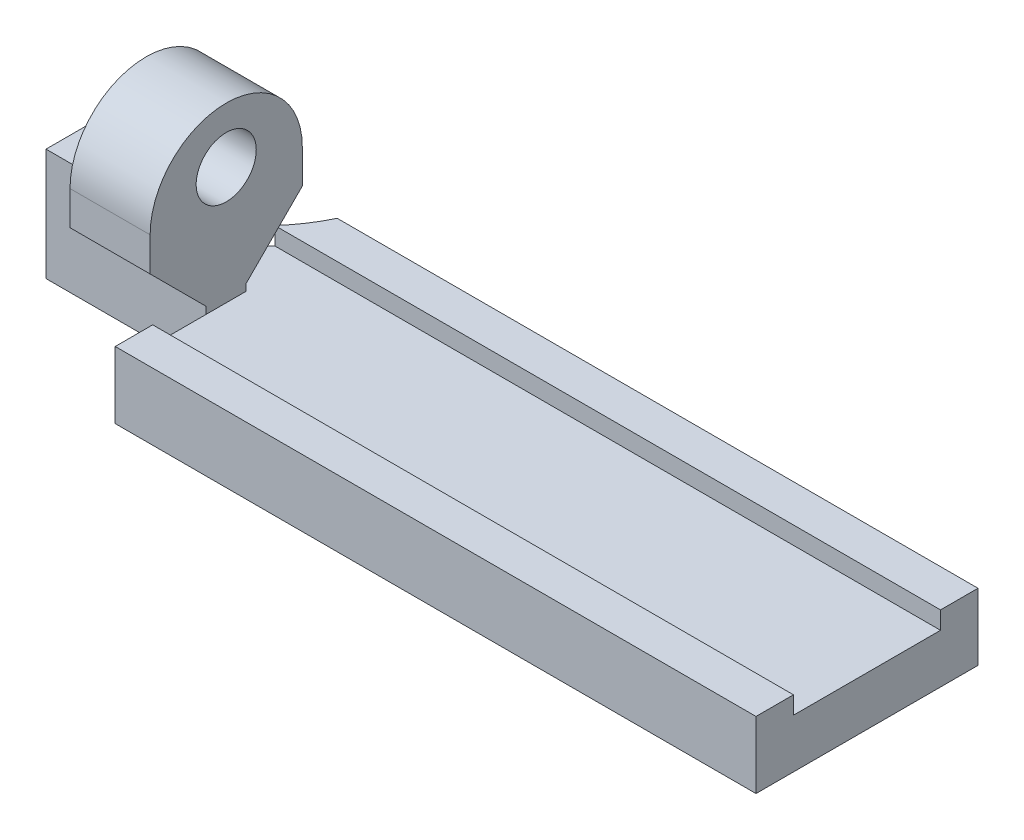
ISO-10303-21;
HEADER;
FILE_DESCRIPTION(('STEP AP214'),'2;1');
FILE_NAME('part.step','',(''),(''),'','','');
FILE_SCHEMA(('AUTOMOTIVE_DESIGN { 1 0 10303 214 1 1 1 1 }'));
ENDSEC;
DATA;
#1=APPLICATION_CONTEXT('core data for automotive mechanical design processes');
#2=APPLICATION_PROTOCOL_DEFINITION('international standard','automotive_design',2000,#1);
#3=PRODUCT_CONTEXT('',#1,'mechanical');
#4=PRODUCT('Part','Part','',(#3));
#5=PRODUCT_RELATED_PRODUCT_CATEGORY('part','',(#4));
#6=PRODUCT_DEFINITION_FORMATION('','',#4);
#7=PRODUCT_DEFINITION_CONTEXT('part definition',#1,'design');
#8=PRODUCT_DEFINITION('design','',#6,#7);
#9=PRODUCT_DEFINITION_SHAPE('','',#8);
#10=(LENGTH_UNIT() NAMED_UNIT(*) SI_UNIT(.MILLI.,.METRE.));
#11=(NAMED_UNIT(*) PLANE_ANGLE_UNIT() SI_UNIT($,.RADIAN.));
#12=(NAMED_UNIT(*) SI_UNIT($,.STERADIAN.) SOLID_ANGLE_UNIT());
#13=UNCERTAINTY_MEASURE_WITH_UNIT(LENGTH_MEASURE(1.E-05),#10,'distance_accuracy_value','');
#14=(GEOMETRIC_REPRESENTATION_CONTEXT(3) GLOBAL_UNCERTAINTY_ASSIGNED_CONTEXT((#13)) GLOBAL_UNIT_ASSIGNED_CONTEXT((#10,
#11,#12)) REPRESENTATION_CONTEXT('',''));
#15=CARTESIAN_POINT('',(0.,0.,0.));
#16=DIRECTION('',(0.,0.,1.));
#17=DIRECTION('',(1.,0.,0.));
#18=AXIS2_PLACEMENT_3D('',#15,#16,#17);
#19=CARTESIAN_POINT('',(0.,8.89,3.175));
#20=DIRECTION('',(-1.,0.,0.));
#21=DIRECTION('',(0.,0.,1.));
#22=AXIS2_PLACEMENT_3D('',#19,#20,#21);
#23=PLANE('',#22);
#24=CARTESIAN_POINT('',(0.,13.208,1.58750000000003));
#25=DIRECTION('',(1.,0.,0.));
#26=DIRECTION('',(0.,0.,-1.));
#27=AXIS2_PLACEMENT_3D('',#24,#25,#26);
#28=CIRCLE('',#27,2.38125);
#29=CARTESIAN_POINT('',(0.,13.208,-0.793749999999969));
#30=VERTEX_POINT('',#29);
#31=EDGE_CURVE('E202',#30,#30,#28,.T.);
#32=ORIENTED_EDGE('',*,*,#31,.F.);
#33=EDGE_LOOP('',(#32));
#34=FACE_BOUND('',#33,.T.);
#35=DIRECTION('',(0.,0.,1.));
#36=VECTOR('',#35,1.);
#37=CARTESIAN_POINT('',(0.,3.89555823391104,3.175));
#38=LINE('',#37,#36);
#39=CARTESIAN_POINT('',(0.,3.89555823391104,0.));
#40=VERTEX_POINT('',#39);
#41=CARTESIAN_POINT('',(0.,3.89555823391104,3.175));
#42=VERTEX_POINT('',#41);
#43=EDGE_CURVE('E285',#40,#42,#38,.T.);
#44=ORIENTED_EDGE('',*,*,#43,.F.);
#45=DIRECTION('',(0.,1.,0.));
#46=VECTOR('',#45,1.);
#47=CARTESIAN_POINT('',(0.,8.89,0.));
#48=LINE('',#47,#46);
#49=CARTESIAN_POINT('',(0.,4.445,0.));
#50=VERTEX_POINT('',#49);
#51=EDGE_CURVE('E251',#40,#50,#48,.T.);
#52=ORIENTED_EDGE('',*,*,#51,.T.);
#53=DIRECTION('',(0.,0.707106781186549,-0.707106781186546));
#54=VECTOR('',#53,1.);
#55=CARTESIAN_POINT('',(0.,4.445,0.));
#56=LINE('',#55,#54);
#57=CARTESIAN_POINT('',(0.,8.89,-4.44499999999998));
#58=VERTEX_POINT('',#57);
#59=EDGE_CURVE('E206',#50,#58,#56,.T.);
#60=ORIENTED_EDGE('',*,*,#59,.T.);
#61=DIRECTION('',(0.,1.,0.));
#62=VECTOR('',#61,1.);
#63=CARTESIAN_POINT('',(0.,8.89,-4.44499999999998));
#64=LINE('',#63,#62);
#65=CARTESIAN_POINT('',(0.,11.578578051239,-4.44499999999998));
#66=VERTEX_POINT('',#65);
#67=EDGE_CURVE('E237',#58,#66,#64,.T.);
#68=ORIENTED_EDGE('',*,*,#67,.T.);
#69=CARTESIAN_POINT('',(0.,11.578578051239,1.58750000000003));
#70=DIRECTION('',(1.,0.,0.));
#71=DIRECTION('',(0.,0.,1.));
#72=AXIS2_PLACEMENT_3D('',#69,#70,#71);
#73=CIRCLE('',#72,6.03250000000002);
#74=CARTESIAN_POINT('',(0.,11.578578051239,7.62000000000005));
#75=VERTEX_POINT('',#74);
#76=EDGE_CURVE('E240',#66,#75,#73,.T.);
#77=ORIENTED_EDGE('',*,*,#76,.T.);
#78=DIRECTION('',(0.,-1.,0.));
#79=VECTOR('',#78,1.);
#80=CARTESIAN_POINT('',(0.,8.88999999999995,7.62000000000005));
#81=LINE('',#80,#79);
#82=CARTESIAN_POINT('',(0.,8.88999999999995,7.62000000000005));
#83=VERTEX_POINT('',#82);
#84=EDGE_CURVE('E243',#75,#83,#81,.T.);
#85=ORIENTED_EDGE('',*,*,#84,.T.);
#86=DIRECTION('',(0.,-0.70710678118654,-0.707106781186555));
#87=VECTOR('',#86,1.);
#88=CARTESIAN_POINT('',(0.,4.445,3.175));
#89=LINE('',#88,#87);
#90=CARTESIAN_POINT('',(0.,4.445,3.175));
#91=VERTEX_POINT('',#90);
#92=EDGE_CURVE('E213',#83,#91,#89,.T.);
#93=ORIENTED_EDGE('',*,*,#92,.T.);
#94=DIRECTION('',(0.,1.,0.));
#95=VECTOR('',#94,1.);
#96=CARTESIAN_POINT('',(0.,8.89,3.175));
#97=LINE('',#96,#95);
#98=EDGE_CURVE('E265',#42,#91,#97,.T.);
#99=ORIENTED_EDGE('',*,*,#98,.F.);
#100=EDGE_LOOP('',(#44,#52,#60,#68,#77,#85,#93,#99));
#101=FACE_BOUND('',#100,.T.);
#102=ADVANCED_FACE('F33',(#34,#101),#23,.F.);
#103=CARTESIAN_POINT('',(-12.7,8.89,3.175));
#104=DIRECTION('',(0.,-1.,0.));
#105=DIRECTION('',(0.,0.,-1.));
#106=AXIS2_PLACEMENT_3D('',#103,#104,#105);
#107=PLANE('',#106);
#108=CARTESIAN_POINT('',(-7.62,8.89,1.5875));
#109=DIRECTION('',(0.,1.,0.));
#110=DIRECTION('',(0.,0.,1.));
#111=AXIS2_PLACEMENT_3D('',#108,#109,#110);
#112=CIRCLE('',#111,1.190625);
#113=CARTESIAN_POINT('',(-7.62,8.89,2.778125));
#114=VERTEX_POINT('',#113);
#115=EDGE_CURVE('E191',#114,#114,#112,.T.);
#116=ORIENTED_EDGE('',*,*,#115,.F.);
#117=EDGE_LOOP('',(#116));
#118=FACE_BOUND('',#117,.T.);
#119=DIRECTION('',(-1.,0.,0.));
#120=VECTOR('',#119,1.);
#121=CARTESIAN_POINT('',(-12.7,8.89,3.175));
#122=LINE('',#121,#120);
#123=CARTESIAN_POINT('',(-6.35,8.89,3.175));
#124=VERTEX_POINT('',#123);
#125=CARTESIAN_POINT('',(-12.7,8.89,3.175));
#126=VERTEX_POINT('',#125);
#127=EDGE_CURVE('E264',#124,#126,#122,.T.);
#128=ORIENTED_EDGE('',*,*,#127,.F.);
#129=DIRECTION('',(0.,0.,-1.));
#130=VECTOR('',#129,1.);
#131=CARTESIAN_POINT('',(-6.35,8.89,3.175));
#132=LINE('',#131,#130);
#133=CARTESIAN_POINT('',(-6.35,8.89,0.));
#134=VERTEX_POINT('',#133);
#135=EDGE_CURVE('E212',#124,#134,#132,.T.);
#136=ORIENTED_EDGE('',*,*,#135,.T.);
#137=DIRECTION('',(-1.,0.,0.));
#138=VECTOR('',#137,1.);
#139=CARTESIAN_POINT('',(-12.7,8.89,0.));
#140=LINE('',#139,#138);
#141=CARTESIAN_POINT('',(-12.7,8.89,0.));
#142=VERTEX_POINT('',#141);
#143=EDGE_CURVE('E273',#134,#142,#140,.T.);
#144=ORIENTED_EDGE('',*,*,#143,.T.);
#145=DIRECTION('',(0.,0.,-1.));
#146=VECTOR('',#145,1.);
#147=CARTESIAN_POINT('',(-12.7,8.89,3.175));
#148=LINE('',#147,#146);
#149=EDGE_CURVE('E282',#126,#142,#148,.T.);
#150=ORIENTED_EDGE('',*,*,#149,.F.);
#151=EDGE_LOOP('',(#128,#136,#144,#150));
#152=FACE_BOUND('',#151,.T.);
#153=ADVANCED_FACE('F370',(#118,#152),#107,.F.);
#154=CARTESIAN_POINT('',(-12.7,0.,3.175));
#155=DIRECTION('',(1.,0.,0.));
#156=DIRECTION('',(0.,0.,-1.));
#157=AXIS2_PLACEMENT_3D('',#154,#155,#156);
#158=PLANE('',#157);
#159=DIRECTION('',(0.,-1.,0.));
#160=VECTOR('',#159,1.);
#161=CARTESIAN_POINT('',(-12.7,0.,0.));
#162=LINE('',#161,#160);
#163=CARTESIAN_POINT('',(-12.7,0.,0.));
#164=VERTEX_POINT('',#163);
#165=EDGE_CURVE('E275',#142,#164,#162,.T.);
#166=ORIENTED_EDGE('',*,*,#165,.T.);
#167=DIRECTION('',(0.,0.,-1.));
#168=VECTOR('',#167,1.);
#169=CARTESIAN_POINT('',(-12.7,0.,3.175));
#170=LINE('',#169,#168);
#171=CARTESIAN_POINT('',(-12.7,0.,3.175));
#172=VERTEX_POINT('',#171);
#173=EDGE_CURVE('E271',#172,#164,#170,.T.);
#174=ORIENTED_EDGE('',*,*,#173,.F.);
#175=DIRECTION('',(0.,-1.,0.));
#176=VECTOR('',#175,1.);
#177=CARTESIAN_POINT('',(-12.7,0.,3.175));
#178=LINE('',#177,#176);
#179=EDGE_CURVE('E267',#126,#172,#178,.T.);
#180=ORIENTED_EDGE('',*,*,#179,.F.);
#181=ORIENTED_EDGE('',*,*,#149,.T.);
#182=EDGE_LOOP('',(#166,#174,#180,#181));
#183=FACE_BOUND('',#182,.T.);
#184=ADVANCED_FACE('F376',(#183),#158,.F.);
#185=CARTESIAN_POINT('',(0.,0.,3.175));
#186=DIRECTION('',(0.,1.,0.));
#187=DIRECTION('',(0.,0.,1.));
#188=AXIS2_PLACEMENT_3D('',#185,#186,#187);
#189=PLANE('',#188);
#190=CARTESIAN_POINT('',(-7.62,0.,1.5875));
#191=DIRECTION('',(0.,1.,0.));
#192=DIRECTION('',(0.,0.,1.));
#193=AXIS2_PLACEMENT_3D('',#190,#191,#192);
#194=CIRCLE('',#193,1.190625);
#195=CARTESIAN_POINT('',(-7.62,0.,2.778125));
#196=VERTEX_POINT('',#195);
#197=EDGE_CURVE('E194',#196,#196,#194,.F.);
#198=ORIENTED_EDGE('',*,*,#197,.F.);
#199=EDGE_LOOP('',(#198));
#200=FACE_BOUND('',#199,.T.);
#201=DIRECTION('',(1.,0.,0.));
#202=VECTOR('',#201,1.);
#203=CARTESIAN_POINT('',(0.,0.,0.));
#204=LINE('',#203,#202);
#205=CARTESIAN_POINT('',(-11.4532860381116,0.,0.));
#206=VERTEX_POINT('',#205);
#207=EDGE_CURVE('E277',#164,#206,#204,.T.);
#208=ORIENTED_EDGE('',*,*,#207,.T.);
#209=CARTESIAN_POINT('',(-11.4532860381116,0.,-12.7));
#210=DIRECTION('',(0.,1.,0.));
#211=DIRECTION('',(0.,0.,1.));
#212=AXIS2_PLACEMENT_3D('',#209,#210,#211);
#213=CIRCLE('',#212,12.7);
#214=CARTESIAN_POINT('',(0.,0.,-7.21253802480625));
#215=VERTEX_POINT('',#214);
#216=EDGE_CURVE('E11',#206,#215,#213,.T.);
#217=ORIENTED_EDGE('',*,*,#216,.T.);
#218=DIRECTION('',(-1.,0.,0.));
#219=VECTOR('',#218,1.);
#220=CARTESIAN_POINT('',(50.8,0.,-7.21253802480625));
#221=LINE('',#220,#219);
#222=CARTESIAN_POINT('',(50.8,0.,-7.21253802480625));
#223=VERTEX_POINT('',#222);
#224=EDGE_CURVE('E311',#223,#215,#221,.T.);
#225=ORIENTED_EDGE('',*,*,#224,.F.);
#226=DIRECTION('',(0.,0.,-1.));
#227=VECTOR('',#226,1.);
#228=CARTESIAN_POINT('',(50.8,0.,10.3875380248062));
#229=LINE('',#228,#227);
#230=CARTESIAN_POINT('',(50.8,0.,10.3875380248062));
#231=VERTEX_POINT('',#230);
#232=EDGE_CURVE('E345',#231,#223,#229,.T.);
#233=ORIENTED_EDGE('',*,*,#232,.F.);
#234=DIRECTION('',(-1.,0.,0.));
#235=VECTOR('',#234,1.);
#236=CARTESIAN_POINT('',(50.8,0.,10.3875380248062));
#237=LINE('',#236,#235);
#238=CARTESIAN_POINT('',(0.,0.,10.3875380248062));
#239=VERTEX_POINT('',#238);
#240=EDGE_CURVE('E196',#231,#239,#237,.T.);
#241=ORIENTED_EDGE('',*,*,#240,.T.);
#242=DIRECTION('',(0.,0.,-1.));
#243=VECTOR('',#242,1.);
#244=CARTESIAN_POINT('',(0.,0.,-7.21253802480625));
#245=LINE('',#244,#243);
#246=CARTESIAN_POINT('',(0.,0.,3.175));
#247=VERTEX_POINT('',#246);
#248=EDGE_CURVE('E330',#239,#247,#245,.T.);
#249=ORIENTED_EDGE('',*,*,#248,.T.);
#250=DIRECTION('',(1.,0.,0.));
#251=VECTOR('',#250,1.);
#252=CARTESIAN_POINT('',(0.,0.,3.175));
#253=LINE('',#252,#251);
#254=EDGE_CURVE('E269',#172,#247,#253,.T.);
#255=ORIENTED_EDGE('',*,*,#254,.F.);
#256=ORIENTED_EDGE('',*,*,#173,.T.);
#257=EDGE_LOOP('',(#208,#217,#225,#233,#241,#249,#255,#256));
#258=FACE_BOUND('',#257,.T.);
#259=ADVANCED_FACE('F309',(#200,#258),#189,.F.);
#260=CARTESIAN_POINT('',(0.,0.,3.175));
#261=DIRECTION('',(0.,0.,-1.));
#262=DIRECTION('',(-1.,0.,0.));
#263=AXIS2_PLACEMENT_3D('',#260,#261,#262);
#264=PLANE('',#263);
#265=EDGE_CURVE('E262',#247,#42,#97,.T.);
#266=ORIENTED_EDGE('',*,*,#265,.T.);
#267=ORIENTED_EDGE('',*,*,#98,.T.);
#268=DIRECTION('',(1.,0.,0.));
#269=VECTOR('',#268,1.);
#270=CARTESIAN_POINT('',(-6.35,4.445,3.175));
#271=LINE('',#270,#269);
#272=CARTESIAN_POINT('',(-6.35,4.445,3.175));
#273=VERTEX_POINT('',#272);
#274=EDGE_CURVE('E248',#273,#91,#271,.T.);
#275=ORIENTED_EDGE('',*,*,#274,.F.);
#276=DIRECTION('',(0.,1.,0.));
#277=VECTOR('',#276,1.);
#278=CARTESIAN_POINT('',(-6.35,4.445,3.175));
#279=LINE('',#278,#277);
#280=EDGE_CURVE('E209',#273,#124,#279,.T.);
#281=ORIENTED_EDGE('',*,*,#280,.T.);
#282=ORIENTED_EDGE('',*,*,#127,.T.);
#283=ORIENTED_EDGE('',*,*,#179,.T.);
#284=ORIENTED_EDGE('',*,*,#254,.T.);
#285=EDGE_LOOP('',(#266,#267,#275,#281,#282,#283,#284));
#286=FACE_BOUND('',#285,.T.);
#287=ADVANCED_FACE('F358',(#286),#264,.F.);
#288=CARTESIAN_POINT('',(0.,0.,0.));
#289=DIRECTION('',(0.,0.,-1.));
#290=DIRECTION('',(-1.,0.,0.));
#291=AXIS2_PLACEMENT_3D('',#288,#289,#290);
#292=PLANE('',#291);
#293=ORIENTED_EDGE('',*,*,#51,.F.);
#294=DIRECTION('',(-1.,0.,0.));
#295=VECTOR('',#294,1.);
#296=CARTESIAN_POINT('',(0.,3.89555823391104,0.));
#297=LINE('',#296,#295);
#298=CARTESIAN_POINT('',(-11.4532860381116,3.89555823391104,0.));
#299=VERTEX_POINT('',#298);
#300=EDGE_CURVE('E48',#40,#299,#297,.T.);
#301=ORIENTED_EDGE('',*,*,#300,.T.);
#302=DIRECTION('',(0.,1.,0.));
#303=VECTOR('',#302,1.);
#304=CARTESIAN_POINT('',(-11.4532860381116,0.,0.));
#305=LINE('',#304,#303);
#306=EDGE_CURVE('E286',#299,#206,#305,.F.);
#307=ORIENTED_EDGE('',*,*,#306,.T.);
#308=ORIENTED_EDGE('',*,*,#207,.F.);
#309=ORIENTED_EDGE('',*,*,#165,.F.);
#310=ORIENTED_EDGE('',*,*,#143,.F.);
#311=DIRECTION('',(0.,-1.,0.));
#312=VECTOR('',#311,1.);
#313=CARTESIAN_POINT('',(-6.35,4.445,0.));
#314=LINE('',#313,#312);
#315=CARTESIAN_POINT('',(-6.35,4.445,0.));
#316=VERTEX_POINT('',#315);
#317=EDGE_CURVE('E216',#134,#316,#314,.T.);
#318=ORIENTED_EDGE('',*,*,#317,.T.);
#319=DIRECTION('',(1.,0.,0.));
#320=VECTOR('',#319,1.);
#321=CARTESIAN_POINT('',(-6.35,4.445,0.));
#322=LINE('',#321,#320);
#323=EDGE_CURVE('E234',#316,#50,#322,.T.);
#324=ORIENTED_EDGE('',*,*,#323,.T.);
#325=EDGE_LOOP('',(#293,#301,#307,#308,#309,#310,#318,#324));
#326=FACE_BOUND('',#325,.T.);
#327=ADVANCED_FACE('F299',(#326),#292,.T.);
#328=CARTESIAN_POINT('',(-6.35,4.445,3.175));
#329=DIRECTION('',(0.,-0.707106781186555,0.70710678118654));
#330=DIRECTION('',(0.,-0.70710678118654,-0.707106781186555));
#331=AXIS2_PLACEMENT_3D('',#328,#329,#330);
#332=PLANE('',#331);
#333=ORIENTED_EDGE('',*,*,#92,.F.);
#334=DIRECTION('',(1.,0.,0.));
#335=VECTOR('',#334,1.);
#336=CARTESIAN_POINT('',(-6.35,8.88999999999995,7.62000000000005));
#337=LINE('',#336,#335);
#338=CARTESIAN_POINT('',(-6.35,8.88999999999995,7.62000000000005));
#339=VERTEX_POINT('',#338);
#340=EDGE_CURVE('E252',#339,#83,#337,.T.);
#341=ORIENTED_EDGE('',*,*,#340,.F.);
#342=DIRECTION('',(0.,-0.70710678118654,-0.707106781186555));
#343=VECTOR('',#342,1.);
#344=CARTESIAN_POINT('',(-6.35,4.445,3.175));
#345=LINE('',#344,#343);
#346=EDGE_CURVE('E231',#339,#273,#345,.T.);
#347=ORIENTED_EDGE('',*,*,#346,.T.);
#348=ORIENTED_EDGE('',*,*,#274,.T.);
#349=EDGE_LOOP('',(#333,#341,#347,#348));
#350=FACE_BOUND('',#349,.T.);
#351=ADVANCED_FACE('F364',(#350),#332,.T.);
#352=CARTESIAN_POINT('',(-6.35,8.88999999999995,7.62000000000005));
#353=DIRECTION('',(0.,0.,1.));
#354=DIRECTION('',(0.,-1.,0.));
#355=AXIS2_PLACEMENT_3D('',#352,#353,#354);
#356=PLANE('',#355);
#357=ORIENTED_EDGE('',*,*,#84,.F.);
#358=DIRECTION('',(1.,0.,0.));
#359=VECTOR('',#358,1.);
#360=CARTESIAN_POINT('',(-6.35,11.578578051239,7.62000000000005));
#361=LINE('',#360,#359);
#362=CARTESIAN_POINT('',(-6.35,11.578578051239,7.62000000000005));
#363=VERTEX_POINT('',#362);
#364=EDGE_CURVE('E254',#363,#75,#361,.T.);
#365=ORIENTED_EDGE('',*,*,#364,.F.);
#366=DIRECTION('',(0.,-1.,0.));
#367=VECTOR('',#366,1.);
#368=CARTESIAN_POINT('',(-6.35,8.88999999999995,7.62000000000005));
#369=LINE('',#368,#367);
#370=EDGE_CURVE('E228',#363,#339,#369,.T.);
#371=ORIENTED_EDGE('',*,*,#370,.T.);
#372=ORIENTED_EDGE('',*,*,#340,.T.);
#373=EDGE_LOOP('',(#357,#365,#371,#372));
#374=FACE_BOUND('',#373,.T.);
#375=ADVANCED_FACE('F392',(#374),#356,.T.);
#376=CARTESIAN_POINT('',(-6.35,11.578578051239,1.58750000000003));
#377=DIRECTION('',(1.,0.,0.));
#378=DIRECTION('',(0.,0.,-1.));
#379=AXIS2_PLACEMENT_3D('',#376,#377,#378);
#380=CYLINDRICAL_SURFACE('',#379,6.03250000000002);
#381=ORIENTED_EDGE('',*,*,#76,.F.);
#382=DIRECTION('',(1.,0.,0.));
#383=VECTOR('',#382,1.);
#384=CARTESIAN_POINT('',(-6.35,11.578578051239,-4.44499999999998));
#385=LINE('',#384,#383);
#386=CARTESIAN_POINT('',(-6.35,11.578578051239,-4.44499999999998));
#387=VERTEX_POINT('',#386);
#388=EDGE_CURVE('E256',#387,#66,#385,.T.);
#389=ORIENTED_EDGE('',*,*,#388,.F.);
#390=CARTESIAN_POINT('',(-6.35,11.578578051239,1.58750000000003));
#391=DIRECTION('',(1.,0.,0.));
#392=DIRECTION('',(0.,0.,1.));
#393=AXIS2_PLACEMENT_3D('',#390,#391,#392);
#394=CIRCLE('',#393,6.03250000000002);
#395=EDGE_CURVE('E225',#387,#363,#394,.T.);
#396=ORIENTED_EDGE('',*,*,#395,.T.);
#397=ORIENTED_EDGE('',*,*,#364,.T.);
#398=EDGE_LOOP('',(#381,#389,#396,#397));
#399=FACE_BOUND('',#398,.T.);
#400=ADVANCED_FACE('F389',(#399),#380,.T.);
#401=CARTESIAN_POINT('',(-6.35,8.89,-4.44499999999998));
#402=DIRECTION('',(0.,0.,-1.));
#403=DIRECTION('',(0.,1.,0.));
#404=AXIS2_PLACEMENT_3D('',#401,#402,#403);
#405=PLANE('',#404);
#406=ORIENTED_EDGE('',*,*,#67,.F.);
#407=DIRECTION('',(1.,0.,0.));
#408=VECTOR('',#407,1.);
#409=CARTESIAN_POINT('',(-6.35,8.89,-4.44499999999998));
#410=LINE('',#409,#408);
#411=CARTESIAN_POINT('',(-6.35,8.89,-4.44499999999998));
#412=VERTEX_POINT('',#411);
#413=EDGE_CURVE('E258',#412,#58,#410,.T.);
#414=ORIENTED_EDGE('',*,*,#413,.F.);
#415=DIRECTION('',(0.,1.,0.));
#416=VECTOR('',#415,1.);
#417=CARTESIAN_POINT('',(-6.35,8.89,-4.44499999999998));
#418=LINE('',#417,#416);
#419=EDGE_CURVE('E222',#412,#387,#418,.T.);
#420=ORIENTED_EDGE('',*,*,#419,.T.);
#421=ORIENTED_EDGE('',*,*,#388,.T.);
#422=EDGE_LOOP('',(#406,#414,#420,#421));
#423=FACE_BOUND('',#422,.T.);
#424=ADVANCED_FACE('F387',(#423),#405,.T.);
#425=CARTESIAN_POINT('',(-6.35,4.445,0.));
#426=DIRECTION('',(0.,-0.707106781186546,-0.707106781186549));
#427=DIRECTION('',(0.,0.707106781186549,-0.707106781186546));
#428=AXIS2_PLACEMENT_3D('',#425,#426,#427);
#429=PLANE('',#428);
#430=ORIENTED_EDGE('',*,*,#59,.F.);
#431=ORIENTED_EDGE('',*,*,#323,.F.);
#432=DIRECTION('',(0.,0.707106781186549,-0.707106781186546));
#433=VECTOR('',#432,1.);
#434=CARTESIAN_POINT('',(-6.35,4.445,0.));
#435=LINE('',#434,#433);
#436=EDGE_CURVE('E219',#316,#412,#435,.T.);
#437=ORIENTED_EDGE('',*,*,#436,.T.);
#438=ORIENTED_EDGE('',*,*,#413,.T.);
#439=EDGE_LOOP('',(#430,#431,#437,#438));
#440=FACE_BOUND('',#439,.T.);
#441=ADVANCED_FACE('F383',(#440),#429,.T.);
#442=CARTESIAN_POINT('',(-6.35,11.578578051239,1.58750000000003));
#443=DIRECTION('',(-1.,0.,0.));
#444=DIRECTION('',(0.,0.,1.));
#445=AXIS2_PLACEMENT_3D('',#442,#443,#444);
#446=PLANE('',#445);
#447=CARTESIAN_POINT('',(-6.35,13.208,1.58750000000003));
#448=DIRECTION('',(1.,0.,0.));
#449=DIRECTION('',(0.,0.,-1.));
#450=AXIS2_PLACEMENT_3D('',#447,#448,#449);
#451=CIRCLE('',#450,2.38125);
#452=CARTESIAN_POINT('',(-6.35,13.208,-0.793749999999969));
#453=VERTEX_POINT('',#452);
#454=EDGE_CURVE('E203',#453,#453,#451,.T.);
#455=ORIENTED_EDGE('',*,*,#454,.T.);
#456=EDGE_LOOP('',(#455));
#457=FACE_BOUND('',#456,.T.);
#458=ORIENTED_EDGE('',*,*,#280,.F.);
#459=ORIENTED_EDGE('',*,*,#346,.F.);
#460=ORIENTED_EDGE('',*,*,#370,.F.);
#461=ORIENTED_EDGE('',*,*,#395,.F.);
#462=ORIENTED_EDGE('',*,*,#419,.F.);
#463=ORIENTED_EDGE('',*,*,#436,.F.);
#464=ORIENTED_EDGE('',*,*,#317,.F.);
#465=ORIENTED_EDGE('',*,*,#135,.F.);
#466=EDGE_LOOP('',(#458,#459,#460,#461,#462,#463,#464,#465));
#467=FACE_BOUND('',#466,.T.);
#468=ADVANCED_FACE('F378',(#457,#467),#446,.T.);
#469=CARTESIAN_POINT('',(-6.35,13.208,1.58750000000003));
#470=DIRECTION('',(1.,0.,0.));
#471=DIRECTION('',(0.,0.,-1.));
#472=AXIS2_PLACEMENT_3D('',#469,#470,#471);
#473=CYLINDRICAL_SURFACE('',#472,2.38125);
#474=ORIENTED_EDGE('',*,*,#454,.F.);
#475=EDGE_LOOP('',(#474));
#476=FACE_BOUND('',#475,.T.);
#477=ORIENTED_EDGE('',*,*,#31,.T.);
#478=EDGE_LOOP('',(#477));
#479=FACE_BOUND('',#478,.T.);
#480=ADVANCED_FACE('F436',(#476,#479),#473,.F.);
#481=CARTESIAN_POINT('',(-7.62,-0.000999999999999265,1.5875));
#482=DIRECTION('',(0.,1.,0.));
#483=DIRECTION('',(0.,0.,1.));
#484=AXIS2_PLACEMENT_3D('',#481,#482,#483);
#485=CYLINDRICAL_SURFACE('',#484,1.190625);
#486=ORIENTED_EDGE('',*,*,#115,.T.);
#487=EDGE_LOOP('',(#486));
#488=FACE_BOUND('',#487,.T.);
#489=ORIENTED_EDGE('',*,*,#197,.T.);
#490=EDGE_LOOP('',(#489));
#491=FACE_BOUND('',#490,.T.);
#492=ADVANCED_FACE('F444',(#488,#491),#485,.F.);
#493=CARTESIAN_POINT('',(50.8,3.89555823391104,7.41682455146402));
#494=DIRECTION('',(0.,0.,1.));
#495=DIRECTION('',(1.,0.,0.));
#496=AXIS2_PLACEMENT_3D('',#493,#494,#495);
#497=PLANE('',#496);
#498=DIRECTION('',(0.,1.,0.));
#499=VECTOR('',#498,1.);
#500=CARTESIAN_POINT('',(0.,3.89555823391104,7.41682455146402));
#501=LINE('',#500,#499);
#502=CARTESIAN_POINT('',(0.,3.89555823391104,7.41682455146402));
#503=VERTEX_POINT('',#502);
#504=CARTESIAN_POINT('',(0.,5.29683817416681,7.41682455146402));
#505=VERTEX_POINT('',#504);
#506=EDGE_CURVE('E190',#503,#505,#501,.T.);
#507=ORIENTED_EDGE('',*,*,#506,.T.);
#508=DIRECTION('',(-1.,0.,0.));
#509=VECTOR('',#508,1.);
#510=CARTESIAN_POINT('',(50.8,5.29683817416681,7.41682455146402));
#511=LINE('',#510,#509);
#512=CARTESIAN_POINT('',(50.8,5.29683817416681,7.41682455146402));
#513=VERTEX_POINT('',#512);
#514=EDGE_CURVE('E171',#513,#505,#511,.T.);
#515=ORIENTED_EDGE('',*,*,#514,.F.);
#516=DIRECTION('',(0.,1.,0.));
#517=VECTOR('',#516,1.);
#518=CARTESIAN_POINT('',(50.8,3.89555823391104,7.41682455146402));
#519=LINE('',#518,#517);
#520=CARTESIAN_POINT('',(50.8,3.89555823391104,7.41682455146402));
#521=VERTEX_POINT('',#520);
#522=EDGE_CURVE('E178',#521,#513,#519,.T.);
#523=ORIENTED_EDGE('',*,*,#522,.F.);
#524=DIRECTION('',(-1.,0.,0.));
#525=VECTOR('',#524,1.);
#526=CARTESIAN_POINT('',(50.8,3.89555823391104,7.41682455146402));
#527=LINE('',#526,#525);
#528=EDGE_CURVE('E326',#521,#503,#527,.T.);
#529=ORIENTED_EDGE('',*,*,#528,.T.);
#530=EDGE_LOOP('',(#507,#515,#523,#529));
#531=FACE_BOUND('',#530,.T.);
#532=ADVANCED_FACE('F188',(#531),#497,.F.);
#533=CARTESIAN_POINT('',(50.8,5.29683817416681,7.41682455146402));
#534=DIRECTION('',(0.,-1.,0.));
#535=DIRECTION('',(0.,0.,-1.));
#536=AXIS2_PLACEMENT_3D('',#533,#534,#535);
#537=PLANE('',#536);
#538=DIRECTION('',(0.,0.,1.));
#539=VECTOR('',#538,1.);
#540=CARTESIAN_POINT('',(0.,5.29683817416681,7.41682455146402));
#541=LINE('',#540,#539);
#542=CARTESIAN_POINT('',(0.,5.2968381741668,10.3875380248063));
#543=VERTEX_POINT('',#542);
#544=EDGE_CURVE('E336',#505,#543,#541,.T.);
#545=ORIENTED_EDGE('',*,*,#544,.T.);
#546=DIRECTION('',(-1.,0.,0.));
#547=VECTOR('',#546,1.);
#548=CARTESIAN_POINT('',(50.8,5.2968381741668,10.3875380248063));
#549=LINE('',#548,#547);
#550=CARTESIAN_POINT('',(50.8,5.2968381741668,10.3875380248063));
#551=VERTEX_POINT('',#550);
#552=EDGE_CURVE('E174',#551,#543,#549,.T.);
#553=ORIENTED_EDGE('',*,*,#552,.F.);
#554=DIRECTION('',(0.,0.,1.));
#555=VECTOR('',#554,1.);
#556=CARTESIAN_POINT('',(50.8,5.29683817416681,7.41682455146402));
#557=LINE('',#556,#555);
#558=EDGE_CURVE('E167',#513,#551,#557,.T.);
#559=ORIENTED_EDGE('',*,*,#558,.F.);
#560=ORIENTED_EDGE('',*,*,#514,.T.);
#561=EDGE_LOOP('',(#545,#553,#559,#560));
#562=FACE_BOUND('',#561,.T.);
#563=ADVANCED_FACE('F169',(#562),#537,.F.);
#564=CARTESIAN_POINT('',(50.8,5.2968381741668,10.3875380248063));
#565=DIRECTION('',(0.,0.,-1.));
#566=DIRECTION('',(0.,1.,0.));
#567=AXIS2_PLACEMENT_3D('',#564,#565,#566);
#568=PLANE('',#567);
#569=DIRECTION('',(0.,-1.,0.));
#570=VECTOR('',#569,1.);
#571=CARTESIAN_POINT('',(0.,5.2968381741668,10.3875380248063));
#572=LINE('',#571,#570);
#573=EDGE_CURVE('E333',#543,#239,#572,.T.);
#574=ORIENTED_EDGE('',*,*,#573,.T.);
#575=ORIENTED_EDGE('',*,*,#240,.F.);
#576=DIRECTION('',(0.,-1.,0.));
#577=VECTOR('',#576,1.);
#578=CARTESIAN_POINT('',(50.8,5.2968381741668,10.3875380248063));
#579=LINE('',#578,#577);
#580=EDGE_CURVE('E177',#551,#231,#579,.T.);
#581=ORIENTED_EDGE('',*,*,#580,.F.);
#582=ORIENTED_EDGE('',*,*,#552,.T.);
#583=EDGE_LOOP('',(#574,#575,#581,#582));
#584=FACE_BOUND('',#583,.T.);
#585=ADVANCED_FACE('F349',(#584),#568,.F.);
#586=CARTESIAN_POINT('',(50.8,5.2968381741668,-7.21253802480625));
#587=DIRECTION('',(0.,0.,1.));
#588=DIRECTION('',(0.,-1.,0.));
#589=AXIS2_PLACEMENT_3D('',#586,#587,#588);
#590=PLANE('',#589);
#591=DIRECTION('',(0.,1.,0.));
#592=VECTOR('',#591,1.);
#593=CARTESIAN_POINT('',(0.,5.2968381741668,-7.21253802480625));
#594=LINE('',#593,#592);
#595=CARTESIAN_POINT('',(0.,5.2968381741668,-7.21253802480625));
#596=VERTEX_POINT('',#595);
#597=EDGE_CURVE('E305',#215,#596,#594,.T.);
#598=ORIENTED_EDGE('',*,*,#597,.T.);
#599=DIRECTION('',(-1.,0.,0.));
#600=VECTOR('',#599,1.);
#601=CARTESIAN_POINT('',(50.8,5.2968381741668,-7.21253802480625));
#602=LINE('',#601,#600);
#603=CARTESIAN_POINT('',(50.8,5.2968381741668,-7.21253802480625));
#604=VERTEX_POINT('',#603);
#605=EDGE_CURVE('E318',#604,#596,#602,.T.);
#606=ORIENTED_EDGE('',*,*,#605,.F.);
#607=DIRECTION('',(0.,1.,0.));
#608=VECTOR('',#607,1.);
#609=CARTESIAN_POINT('',(50.8,5.2968381741668,-7.21253802480625));
#610=LINE('',#609,#608);
#611=EDGE_CURVE('E317',#223,#604,#610,.T.);
#612=ORIENTED_EDGE('',*,*,#611,.F.);
#613=ORIENTED_EDGE('',*,*,#224,.T.);
#614=EDGE_LOOP('',(#598,#606,#612,#613));
#615=FACE_BOUND('',#614,.T.);
#616=ADVANCED_FACE('F314',(#615),#590,.F.);
#617=CARTESIAN_POINT('',(50.8,5.29683817416681,-4.24182455146402));
#618=DIRECTION('',(0.,-1.,0.));
#619=DIRECTION('',(0.,0.,-1.));
#620=AXIS2_PLACEMENT_3D('',#617,#618,#619);
#621=PLANE('',#620);
#622=ORIENTED_EDGE('',*,*,#605,.T.);
#623=CARTESIAN_POINT('',(-11.4532860381116,5.2968381741668,-12.7));
#624=DIRECTION('',(0.,-1.,0.));
#625=DIRECTION('',(0.,0.,-1.));
#626=AXIS2_PLACEMENT_3D('',#623,#624,#625);
#627=CIRCLE('',#626,12.7);
#628=CARTESIAN_POINT('',(-1.97967700660805,5.29683817416681,-4.24182455146402));
#629=VERTEX_POINT('',#628);
#630=EDGE_CURVE('E289',#596,#629,#627,.T.);
#631=ORIENTED_EDGE('',*,*,#630,.T.);
#632=DIRECTION('',(-1.,0.,0.));
#633=VECTOR('',#632,1.);
#634=CARTESIAN_POINT('',(50.8,5.29683817416681,-4.24182455146402));
#635=LINE('',#634,#633);
#636=CARTESIAN_POINT('',(50.8,5.29683817416681,-4.24182455146402));
#637=VERTEX_POINT('',#636);
#638=EDGE_CURVE('E321',#637,#629,#635,.T.);
#639=ORIENTED_EDGE('',*,*,#638,.F.);
#640=DIRECTION('',(0.,0.,1.));
#641=VECTOR('',#640,1.);
#642=CARTESIAN_POINT('',(50.8,5.29683817416681,-4.24182455146402));
#643=LINE('',#642,#641);
#644=EDGE_CURVE('E342',#604,#637,#643,.T.);
#645=ORIENTED_EDGE('',*,*,#644,.F.);
#646=EDGE_LOOP('',(#622,#631,#639,#645));
#647=FACE_BOUND('',#646,.T.);
#648=ADVANCED_FACE('F480',(#647),#621,.F.);
#649=CARTESIAN_POINT('',(50.8,3.89555823391104,-4.24182455146402));
#650=DIRECTION('',(0.,0.,-1.));
#651=DIRECTION('',(-1.,0.,0.));
#652=AXIS2_PLACEMENT_3D('',#649,#650,#651);
#653=PLANE('',#652);
#654=ORIENTED_EDGE('',*,*,#638,.T.);
#655=DIRECTION('',(0.,-1.,0.));
#656=VECTOR('',#655,1.);
#657=CARTESIAN_POINT('',(-1.97967700660804,5.29683817416681,-4.24182455146402));
#658=LINE('',#657,#656);
#659=CARTESIAN_POINT('',(-1.97967700660805,3.89555823391104,-4.24182455146402));
#660=VERTEX_POINT('',#659);
#661=EDGE_CURVE('E292',#629,#660,#658,.T.);
#662=ORIENTED_EDGE('',*,*,#661,.T.);
#663=DIRECTION('',(-1.,0.,0.));
#664=VECTOR('',#663,1.);
#665=CARTESIAN_POINT('',(50.8,3.89555823391104,-4.24182455146402));
#666=LINE('',#665,#664);
#667=CARTESIAN_POINT('',(50.8,3.89555823391104,-4.24182455146402));
#668=VERTEX_POINT('',#667);
#669=EDGE_CURVE('E54',#668,#660,#666,.T.);
#670=ORIENTED_EDGE('',*,*,#669,.F.);
#671=DIRECTION('',(0.,-1.,0.));
#672=VECTOR('',#671,1.);
#673=CARTESIAN_POINT('',(50.8,3.89555823391104,-4.24182455146402));
#674=LINE('',#673,#672);
#675=EDGE_CURVE('E340',#637,#668,#674,.T.);
#676=ORIENTED_EDGE('',*,*,#675,.F.);
#677=EDGE_LOOP('',(#654,#662,#670,#676));
#678=FACE_BOUND('',#677,.T.);
#679=ADVANCED_FACE('F488',(#678),#653,.F.);
#680=CARTESIAN_POINT('',(50.8,3.89555823391104,3.175));
#681=DIRECTION('',(0.,-1.,0.));
#682=DIRECTION('',(0.,0.,-1.));
#683=AXIS2_PLACEMENT_3D('',#680,#681,#682);
#684=PLANE('',#683);
#685=ORIENTED_EDGE('',*,*,#669,.T.);
#686=CARTESIAN_POINT('',(-11.4532860381116,3.89555823391104,-12.7));
#687=DIRECTION('',(0.,-1.,0.));
#688=DIRECTION('',(0.,0.,-1.));
#689=AXIS2_PLACEMENT_3D('',#686,#687,#688);
#690=CIRCLE('',#689,12.7);
#691=EDGE_CURVE('E41',#660,#299,#690,.T.);
#692=ORIENTED_EDGE('',*,*,#691,.T.);
#693=ORIENTED_EDGE('',*,*,#300,.F.);
#694=ORIENTED_EDGE('',*,*,#43,.T.);
#695=EDGE_CURVE('E186',#42,#503,#38,.T.);
#696=ORIENTED_EDGE('',*,*,#695,.T.);
#697=ORIENTED_EDGE('',*,*,#528,.F.);
#698=DIRECTION('',(0.,0.,1.));
#699=VECTOR('',#698,1.);
#700=CARTESIAN_POINT('',(50.8,3.89555823391104,0.));
#701=LINE('',#700,#699);
#702=EDGE_CURVE('E182',#668,#521,#701,.T.);
#703=ORIENTED_EDGE('',*,*,#702,.F.);
#704=EDGE_LOOP('',(#685,#692,#693,#694,#696,#697,#703));
#705=FACE_BOUND('',#704,.T.);
#706=ADVANCED_FACE('F294',(#705),#684,.F.);
#707=CARTESIAN_POINT('',(50.8,0.,0.));
#708=DIRECTION('',(1.,0.,0.));
#709=DIRECTION('',(0.,0.,-1.));
#710=AXIS2_PLACEMENT_3D('',#707,#708,#709);
#711=PLANE('',#710);
#712=ORIENTED_EDGE('',*,*,#522,.T.);
#713=ORIENTED_EDGE('',*,*,#558,.T.);
#714=ORIENTED_EDGE('',*,*,#580,.T.);
#715=ORIENTED_EDGE('',*,*,#232,.T.);
#716=ORIENTED_EDGE('',*,*,#611,.T.);
#717=ORIENTED_EDGE('',*,*,#644,.T.);
#718=ORIENTED_EDGE('',*,*,#675,.T.);
#719=ORIENTED_EDGE('',*,*,#702,.T.);
#720=EDGE_LOOP('',(#712,#713,#714,#715,#716,#717,#718,#719));
#721=FACE_BOUND('',#720,.T.);
#722=ADVANCED_FACE('F181',(#721),#711,.T.);
#723=CARTESIAN_POINT('',(0.,0.,0.));
#724=DIRECTION('',(1.,0.,0.));
#725=DIRECTION('',(0.,0.,-1.));
#726=AXIS2_PLACEMENT_3D('',#723,#724,#725);
#727=PLANE('',#726);
#728=ORIENTED_EDGE('',*,*,#265,.F.);
#729=ORIENTED_EDGE('',*,*,#248,.F.);
#730=ORIENTED_EDGE('',*,*,#573,.F.);
#731=ORIENTED_EDGE('',*,*,#544,.F.);
#732=ORIENTED_EDGE('',*,*,#506,.F.);
#733=ORIENTED_EDGE('',*,*,#695,.F.);
#734=EDGE_LOOP('',(#728,#729,#730,#731,#732,#733));
#735=FACE_BOUND('',#734,.T.);
#736=ADVANCED_FACE('F354',(#735),#727,.F.);
#737=CARTESIAN_POINT('',(-11.4532860381116,0.,-12.7));
#738=DIRECTION('',(0.,-1.,0.));
#739=DIRECTION('',(0.,0.,-1.));
#740=AXIS2_PLACEMENT_3D('',#737,#738,#739);
#741=CYLINDRICAL_SURFACE('',#740,12.7);
#742=ORIENTED_EDGE('',*,*,#216,.F.);
#743=ORIENTED_EDGE('',*,*,#306,.F.);
#744=ORIENTED_EDGE('',*,*,#691,.F.);
#745=ORIENTED_EDGE('',*,*,#661,.F.);
#746=ORIENTED_EDGE('',*,*,#630,.F.);
#747=ORIENTED_EDGE('',*,*,#597,.F.);
#748=EDGE_LOOP('',(#742,#743,#744,#745,#746,#747));
#749=FACE_BOUND('',#748,.T.);
#750=ADVANCED_FACE('F35',(#749),#741,.F.);
#751=CLOSED_SHELL('',(#102,#153,#184,#259,#287,#327,#351,#375,#400,#424,#441,#468,#480,#492,
#532,#563,#585,#616,#648,#679,#706,#722,#736,#750));
#752=MANIFOLD_SOLID_BREP('B2',#751);
#753=ADVANCED_BREP_SHAPE_REPRESENTATION('',(#18,#752),#14);
#754=SHAPE_DEFINITION_REPRESENTATION(#9,#753);
ENDSEC;
END-ISO-10303-21;
